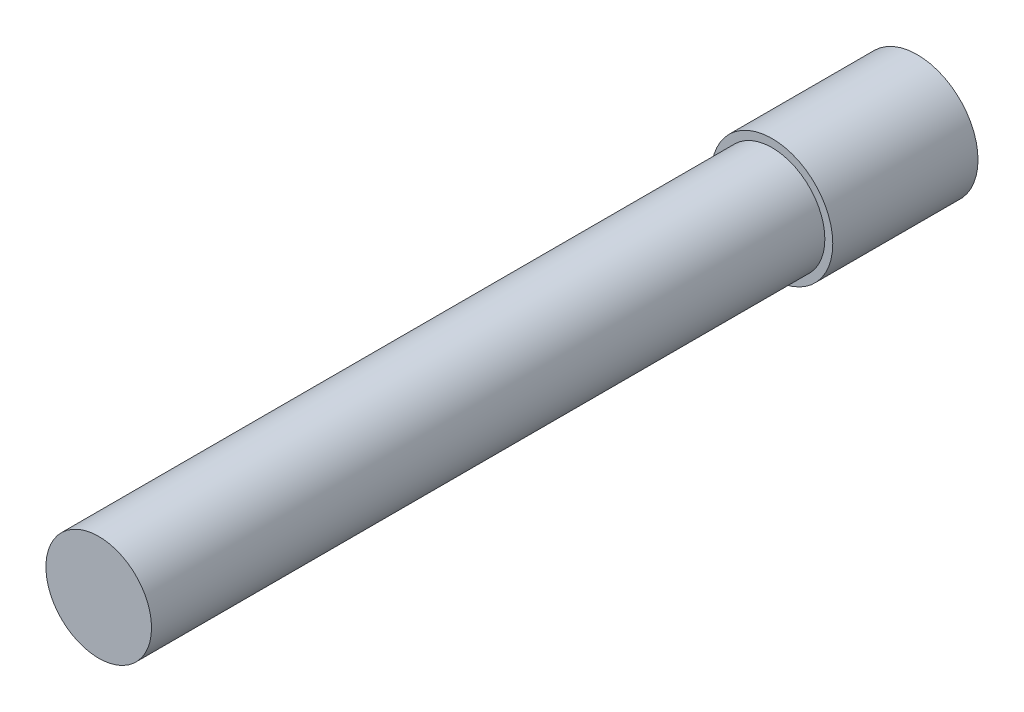
ISO-10303-21;
HEADER;
FILE_DESCRIPTION(('STEP AP214'),'2;1');
FILE_NAME('part.step','',(''),(''),'','','');
FILE_SCHEMA(('AUTOMOTIVE_DESIGN { 1 0 10303 214 1 1 1 1 }'));
ENDSEC;
DATA;
#1=APPLICATION_CONTEXT('core data for automotive mechanical design processes');
#2=APPLICATION_PROTOCOL_DEFINITION('international standard','automotive_design',2000,#1);
#3=PRODUCT_CONTEXT('',#1,'mechanical');
#4=PRODUCT('Part','Part','',(#3));
#5=PRODUCT_RELATED_PRODUCT_CATEGORY('part','',(#4));
#6=PRODUCT_DEFINITION_FORMATION('','',#4);
#7=PRODUCT_DEFINITION_CONTEXT('part definition',#1,'design');
#8=PRODUCT_DEFINITION('design','',#6,#7);
#9=PRODUCT_DEFINITION_SHAPE('','',#8);
#10=(LENGTH_UNIT() NAMED_UNIT(*) SI_UNIT(.MILLI.,.METRE.));
#11=(NAMED_UNIT(*) PLANE_ANGLE_UNIT() SI_UNIT($,.RADIAN.));
#12=(NAMED_UNIT(*) SI_UNIT($,.STERADIAN.) SOLID_ANGLE_UNIT());
#13=UNCERTAINTY_MEASURE_WITH_UNIT(LENGTH_MEASURE(1.E-05),#10,'distance_accuracy_value','');
#14=(GEOMETRIC_REPRESENTATION_CONTEXT(3) GLOBAL_UNCERTAINTY_ASSIGNED_CONTEXT((#13)) GLOBAL_UNIT_ASSIGNED_CONTEXT((#10,
#11,#12)) REPRESENTATION_CONTEXT('',''));
#15=CARTESIAN_POINT('',(0.,0.,0.));
#16=DIRECTION('',(0.,0.,1.));
#17=DIRECTION('',(1.,0.,0.));
#18=AXIS2_PLACEMENT_3D('',#15,#16,#17);
#19=CARTESIAN_POINT('',(0.,0.,5.5));
#20=DIRECTION('',(0.,0.,-1.));
#21=DIRECTION('',(-1.,0.,0.));
#22=AXIS2_PLACEMENT_3D('',#19,#20,#21);
#23=CYLINDRICAL_SURFACE('',#22,2.3);
#24=CARTESIAN_POINT('',(0.,0.,5.5));
#25=DIRECTION('',(0.,0.,1.));
#26=DIRECTION('',(1.,0.,0.));
#27=AXIS2_PLACEMENT_3D('',#24,#25,#26);
#28=CIRCLE('',#27,2.3);
#29=CARTESIAN_POINT('',(2.3,0.,5.5));
#30=VERTEX_POINT('',#29);
#31=EDGE_CURVE('E44',#30,#30,#28,.T.);
#32=ORIENTED_EDGE('',*,*,#31,.F.);
#33=EDGE_LOOP('',(#32));
#34=FACE_BOUND('',#33,.T.);
#35=CARTESIAN_POINT('',(0.,0.,0.));
#36=DIRECTION('',(0.,0.,1.));
#37=DIRECTION('',(1.,0.,0.));
#38=AXIS2_PLACEMENT_3D('',#35,#36,#37);
#39=CIRCLE('',#38,2.3);
#40=CARTESIAN_POINT('',(2.3,0.,0.));
#41=VERTEX_POINT('',#40);
#42=EDGE_CURVE('E40',#41,#41,#39,.T.);
#43=ORIENTED_EDGE('',*,*,#42,.T.);
#44=EDGE_LOOP('',(#43));
#45=FACE_BOUND('',#44,.T.);
#46=ADVANCED_FACE('F37',(#34,#45),#23,.T.);
#47=CARTESIAN_POINT('',(0.,0.,5.5));
#48=DIRECTION('',(0.,0.,1.));
#49=DIRECTION('',(1.,0.,0.));
#50=AXIS2_PLACEMENT_3D('',#47,#48,#49);
#51=PLANE('',#50);
#52=CARTESIAN_POINT('',(0.,0.,5.5));
#53=DIRECTION('',(0.,0.,1.));
#54=DIRECTION('',(1.,0.,0.));
#55=AXIS2_PLACEMENT_3D('',#52,#53,#54);
#56=CIRCLE('',#55,2.);
#57=CARTESIAN_POINT('',(2.,0.,5.5));
#58=VERTEX_POINT('',#57);
#59=EDGE_CURVE('E10',#58,#58,#56,.T.);
#60=ORIENTED_EDGE('',*,*,#59,.F.);
#61=EDGE_LOOP('',(#60));
#62=FACE_BOUND('',#61,.T.);
#63=ORIENTED_EDGE('',*,*,#31,.T.);
#64=EDGE_LOOP('',(#63));
#65=FACE_BOUND('',#64,.T.);
#66=ADVANCED_FACE('F61',(#62,#65),#51,.T.);
#67=CARTESIAN_POINT('',(0.,0.,0.));
#68=DIRECTION('',(0.,0.,1.));
#69=DIRECTION('',(1.,0.,0.));
#70=AXIS2_PLACEMENT_3D('',#67,#68,#69);
#71=PLANE('',#70);
#72=ORIENTED_EDGE('',*,*,#42,.F.);
#73=EDGE_LOOP('',(#72));
#74=FACE_BOUND('',#73,.T.);
#75=ADVANCED_FACE('F58',(#74),#71,.F.);
#76=CARTESIAN_POINT('',(0.,0.,31.));
#77=DIRECTION('',(0.,0.,-1.));
#78=DIRECTION('',(-1.,0.,0.));
#79=AXIS2_PLACEMENT_3D('',#76,#77,#78);
#80=CYLINDRICAL_SURFACE('',#79,2.);
#81=CARTESIAN_POINT('',(0.,0.,31.));
#82=DIRECTION('',(0.,0.,1.));
#83=DIRECTION('',(1.,0.,0.));
#84=AXIS2_PLACEMENT_3D('',#81,#82,#83);
#85=CIRCLE('',#84,2.);
#86=CARTESIAN_POINT('',(2.,0.,31.));
#87=VERTEX_POINT('',#86);
#88=EDGE_CURVE('E50',#87,#87,#85,.T.);
#89=ORIENTED_EDGE('',*,*,#88,.F.);
#90=EDGE_LOOP('',(#89));
#91=FACE_BOUND('',#90,.T.);
#92=ORIENTED_EDGE('',*,*,#59,.T.);
#93=EDGE_LOOP('',(#92));
#94=FACE_BOUND('',#93,.T.);
#95=ADVANCED_FACE('F60',(#91,#94),#80,.T.);
#96=CARTESIAN_POINT('',(0.,0.,31.));
#97=DIRECTION('',(0.,0.,1.));
#98=DIRECTION('',(1.,0.,0.));
#99=AXIS2_PLACEMENT_3D('',#96,#97,#98);
#100=PLANE('',#99);
#101=ORIENTED_EDGE('',*,*,#88,.T.);
#102=EDGE_LOOP('',(#101));
#103=FACE_BOUND('',#102,.T.);
#104=ADVANCED_FACE('F66',(#103),#100,.T.);
#105=CLOSED_SHELL('',(#46,#66,#75,#95,#104));
#106=MANIFOLD_SOLID_BREP('B2',#105);
#107=ADVANCED_BREP_SHAPE_REPRESENTATION('',(#18,#106),#14);
#108=SHAPE_DEFINITION_REPRESENTATION(#9,#107);
ENDSEC;
END-ISO-10303-21;
